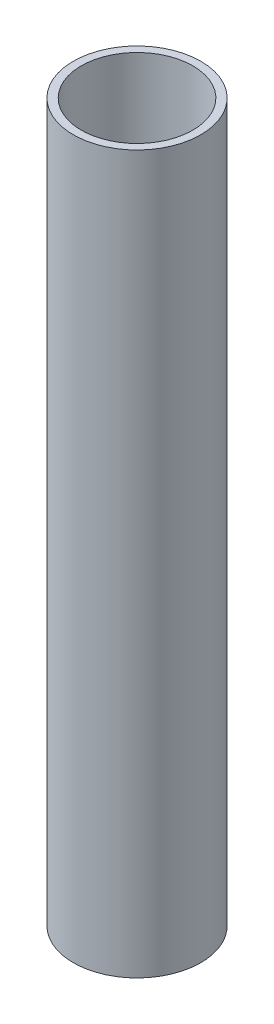
ISO-10303-21;
HEADER;
FILE_DESCRIPTION(('STEP AP214'),'2;1');
FILE_NAME('part.step','',(''),(''),'','','');
FILE_SCHEMA(('AUTOMOTIVE_DESIGN { 1 0 10303 214 1 1 1 1 }'));
ENDSEC;
DATA;
#1=APPLICATION_CONTEXT('core data for automotive mechanical design processes');
#2=APPLICATION_PROTOCOL_DEFINITION('international standard','automotive_design',2000,#1);
#3=PRODUCT_CONTEXT('',#1,'mechanical');
#4=PRODUCT('Part','Part','',(#3));
#5=PRODUCT_RELATED_PRODUCT_CATEGORY('part','',(#4));
#6=PRODUCT_DEFINITION_FORMATION('','',#4);
#7=PRODUCT_DEFINITION_CONTEXT('part definition',#1,'design');
#8=PRODUCT_DEFINITION('design','',#6,#7);
#9=PRODUCT_DEFINITION_SHAPE('','',#8);
#10=(LENGTH_UNIT() NAMED_UNIT(*) SI_UNIT(.MILLI.,.METRE.));
#11=(NAMED_UNIT(*) PLANE_ANGLE_UNIT() SI_UNIT($,.RADIAN.));
#12=(NAMED_UNIT(*) SI_UNIT($,.STERADIAN.) SOLID_ANGLE_UNIT());
#13=UNCERTAINTY_MEASURE_WITH_UNIT(LENGTH_MEASURE(1.E-05),#10,'distance_accuracy_value','');
#14=(GEOMETRIC_REPRESENTATION_CONTEXT(3) GLOBAL_UNCERTAINTY_ASSIGNED_CONTEXT((#13)) GLOBAL_UNIT_ASSIGNED_CONTEXT((#10,
#11,#12)) REPRESENTATION_CONTEXT('',''));
#15=CARTESIAN_POINT('',(0.,0.,0.));
#16=DIRECTION('',(0.,0.,1.));
#17=DIRECTION('',(1.,0.,0.));
#18=AXIS2_PLACEMENT_3D('',#15,#16,#17);
#19=CARTESIAN_POINT('',(0.,90.,0.));
#20=DIRECTION('',(0.,1.,0.));
#21=DIRECTION('',(0.,0.,1.));
#22=AXIS2_PLACEMENT_3D('',#19,#20,#21);
#23=PLANE('',#22);
#24=CARTESIAN_POINT('',(0.,90.,0.));
#25=DIRECTION('',(0.,1.,0.));
#26=DIRECTION('',(0.,0.,1.));
#27=AXIS2_PLACEMENT_3D('',#24,#25,#26);
#28=CIRCLE('',#27,8.);
#29=CARTESIAN_POINT('',(0.,90.,-8.));
#30=VERTEX_POINT('',#29);
#31=EDGE_CURVE('E10',#30,#30,#28,.T.);
#32=ORIENTED_EDGE('',*,*,#31,.T.);
#33=EDGE_LOOP('',(#32));
#34=FACE_BOUND('',#33,.T.);
#35=CARTESIAN_POINT('',(0.,90.,0.));
#36=DIRECTION('',(0.,1.,0.));
#37=DIRECTION('',(0.,0.,1.));
#38=AXIS2_PLACEMENT_3D('',#35,#36,#37);
#39=CIRCLE('',#38,7.);
#40=CARTESIAN_POINT('',(0.,90.,-7.));
#41=VERTEX_POINT('',#40);
#42=EDGE_CURVE('E52',#41,#41,#39,.T.);
#43=ORIENTED_EDGE('',*,*,#42,.F.);
#44=EDGE_LOOP('',(#43));
#45=FACE_BOUND('',#44,.T.);
#46=ADVANCED_FACE('F39',(#34,#45),#23,.T.);
#47=CARTESIAN_POINT('',(0.,0.,0.));
#48=DIRECTION('',(0.,1.,0.));
#49=DIRECTION('',(0.,0.,1.));
#50=AXIS2_PLACEMENT_3D('',#47,#48,#49);
#51=PLANE('',#50);
#52=CARTESIAN_POINT('',(0.,0.,0.));
#53=DIRECTION('',(0.,1.,0.));
#54=DIRECTION('',(0.,0.,1.));
#55=AXIS2_PLACEMENT_3D('',#52,#53,#54);
#56=CIRCLE('',#55,8.);
#57=CARTESIAN_POINT('',(0.,0.,-8.));
#58=VERTEX_POINT('',#57);
#59=EDGE_CURVE('E43',#58,#58,#56,.T.);
#60=ORIENTED_EDGE('',*,*,#59,.F.);
#61=EDGE_LOOP('',(#60));
#62=FACE_BOUND('',#61,.T.);
#63=CARTESIAN_POINT('',(0.,0.,0.));
#64=DIRECTION('',(0.,1.,0.));
#65=DIRECTION('',(0.,0.,1.));
#66=AXIS2_PLACEMENT_3D('',#63,#64,#65);
#67=CIRCLE('',#66,7.);
#68=CARTESIAN_POINT('',(0.,0.,-7.));
#69=VERTEX_POINT('',#68);
#70=EDGE_CURVE('E54',#69,#69,#67,.T.);
#71=ORIENTED_EDGE('',*,*,#70,.T.);
#72=EDGE_LOOP('',(#71));
#73=FACE_BOUND('',#72,.T.);
#74=ADVANCED_FACE('F66',(#62,#73),#51,.F.);
#75=CARTESIAN_POINT('',(0.,90.,0.));
#76=DIRECTION('',(0.,-1.,0.));
#77=DIRECTION('',(0.,0.,-1.));
#78=AXIS2_PLACEMENT_3D('',#75,#76,#77);
#79=CYLINDRICAL_SURFACE('',#78,8.);
#80=CARTESIAN_POINT('',(0.,90.,-8.));
#81=CARTESIAN_POINT('',(0.,89.0625,-8.));
#82=CARTESIAN_POINT('',(0.,88.125,-8.));
#83=CARTESIAN_POINT('',(0.,86.25,-8.));
#84=CARTESIAN_POINT('',(0.,85.3125,-8.));
#85=CARTESIAN_POINT('',(0.,83.4375,-8.));
#86=CARTESIAN_POINT('',(0.,82.5,-8.));
#87=CARTESIAN_POINT('',(0.,80.625,-8.));
#88=CARTESIAN_POINT('',(0.,79.6875,-8.));
#89=CARTESIAN_POINT('',(0.,77.8125,-8.));
#90=CARTESIAN_POINT('',(0.,76.875,-8.));
#91=CARTESIAN_POINT('',(0.,75.,-8.));
#92=CARTESIAN_POINT('',(0.,74.0625,-8.));
#93=CARTESIAN_POINT('',(0.,72.1875,-8.));
#94=CARTESIAN_POINT('',(0.,71.25,-8.));
#95=CARTESIAN_POINT('',(0.,69.375,-8.));
#96=CARTESIAN_POINT('',(0.,68.4375,-8.));
#97=CARTESIAN_POINT('',(0.,66.5625,-8.));
#98=CARTESIAN_POINT('',(0.,65.625,-8.));
#99=CARTESIAN_POINT('',(0.,63.75,-8.));
#100=CARTESIAN_POINT('',(0.,62.8125,-8.));
#101=CARTESIAN_POINT('',(0.,60.9375,-8.));
#102=CARTESIAN_POINT('',(0.,60.,-8.));
#103=CARTESIAN_POINT('',(0.,58.125,-8.));
#104=CARTESIAN_POINT('',(0.,57.1875,-8.));
#105=CARTESIAN_POINT('',(0.,55.3125,-8.));
#106=CARTESIAN_POINT('',(0.,54.375,-8.));
#107=CARTESIAN_POINT('',(0.,52.5,-8.));
#108=CARTESIAN_POINT('',(0.,51.5625,-8.));
#109=CARTESIAN_POINT('',(0.,49.6875,-8.));
#110=CARTESIAN_POINT('',(0.,48.75,-8.));
#111=CARTESIAN_POINT('',(0.,46.875,-8.));
#112=CARTESIAN_POINT('',(0.,45.9375,-8.));
#113=CARTESIAN_POINT('',(0.,44.0625,-8.));
#114=CARTESIAN_POINT('',(0.,43.125,-8.));
#115=CARTESIAN_POINT('',(0.,41.25,-8.));
#116=CARTESIAN_POINT('',(0.,40.3125,-8.));
#117=CARTESIAN_POINT('',(0.,38.4375,-8.));
#118=CARTESIAN_POINT('',(0.,37.5,-8.));
#119=CARTESIAN_POINT('',(0.,35.625,-8.));
#120=CARTESIAN_POINT('',(0.,34.6875,-8.));
#121=CARTESIAN_POINT('',(0.,32.8125,-8.));
#122=CARTESIAN_POINT('',(0.,31.875,-8.));
#123=CARTESIAN_POINT('',(0.,30.,-8.));
#124=CARTESIAN_POINT('',(0.,29.0625,-8.));
#125=CARTESIAN_POINT('',(0.,27.1875,-8.));
#126=CARTESIAN_POINT('',(0.,26.25,-8.));
#127=CARTESIAN_POINT('',(0.,24.375,-8.));
#128=CARTESIAN_POINT('',(0.,23.4375,-8.));
#129=CARTESIAN_POINT('',(0.,21.5625,-8.));
#130=CARTESIAN_POINT('',(0.,20.625,-8.));
#131=CARTESIAN_POINT('',(0.,18.75,-8.));
#132=CARTESIAN_POINT('',(0.,17.8125,-8.));
#133=CARTESIAN_POINT('',(0.,15.9375,-8.));
#134=CARTESIAN_POINT('',(0.,15.,-8.));
#135=CARTESIAN_POINT('',(0.,13.125,-8.));
#136=CARTESIAN_POINT('',(0.,12.1875,-8.));
#137=CARTESIAN_POINT('',(0.,10.3125,-8.));
#138=CARTESIAN_POINT('',(0.,9.37499999999999,-8.));
#139=CARTESIAN_POINT('',(0.,7.49999999999999,-8.));
#140=CARTESIAN_POINT('',(0.,6.56249999999999,-8.));
#141=CARTESIAN_POINT('',(0.,4.68749999999999,-8.));
#142=CARTESIAN_POINT('',(0.,3.74999999999998,-8.));
#143=CARTESIAN_POINT('',(0.,1.87499999999998,-8.));
#144=CARTESIAN_POINT('',(0.,0.937499999999986,-8.));
#145=CARTESIAN_POINT('',(0.,0.,-8.));
#146=B_SPLINE_CURVE_WITH_KNOTS('',3,(#80,#81,#82,#83,#84,#85,#86,#87,#88,#89,#90,#91,#92,#93,
#94,#95,#96,#97,#98,#99,#100,#101,#102,#103,#104,#105,#106,#107,#108,#109,#110,#111,#112,#113,
#114,#115,#116,#117,#118,#119,#120,#121,#122,#123,#124,#125,#126,#127,#128,#129,#130,#131,#132,
#133,#134,#135,#136,#137,#138,#139,#140,#141,#142,#143,#144,#145),.UNSPECIFIED.,.F.,.F.,(4,2,2,
2,2,2,2,2,2,2,2,2,2,2,2,2,2,2,2,2,2,2,2,2,2,2,2,2,2,2,2,2,4),(0.,2.8125,5.62499999999999,
8.43749999999999,11.25,14.0625,16.875,19.6875,22.5,25.3125,28.125,30.9375,33.75,36.5625,39.375,
42.1875,45.,47.8125,50.625,53.4375,56.25,59.0625,61.875,64.6875,67.5,70.3125,73.125,75.9375,
78.75,81.5625,84.375,87.1875,90.),.UNSPECIFIED.);
#147=EDGE_CURVE('BSEAM41',#30,#58,#146,.T.);
#148=ORIENTED_EDGE('',*,*,#31,.F.);
#149=ORIENTED_EDGE('',*,*,#59,.T.);
#150=ORIENTED_EDGE('',*,*,#147,.T.);
#151=ORIENTED_EDGE('',*,*,#147,.F.);
#152=EDGE_LOOP('',(#148,#150,#149,#151));
#153=FACE_BOUND('',#152,.T.);
#154=ADVANCED_FACE('F41',(#153),#79,.T.);
#155=CARTESIAN_POINT('',(0.,90.,0.));
#156=DIRECTION('',(0.,-1.,0.));
#157=DIRECTION('',(0.,0.,-1.));
#158=AXIS2_PLACEMENT_3D('',#155,#156,#157);
#159=CYLINDRICAL_SURFACE('',#158,7.);
#160=CARTESIAN_POINT('',(0.,90.,-7.));
#161=CARTESIAN_POINT('',(0.,89.0625,-7.));
#162=CARTESIAN_POINT('',(0.,88.125,-7.));
#163=CARTESIAN_POINT('',(0.,86.25,-7.));
#164=CARTESIAN_POINT('',(0.,85.3125,-7.));
#165=CARTESIAN_POINT('',(0.,83.4375,-7.));
#166=CARTESIAN_POINT('',(0.,82.5,-7.));
#167=CARTESIAN_POINT('',(0.,80.625,-7.));
#168=CARTESIAN_POINT('',(0.,79.6875,-7.));
#169=CARTESIAN_POINT('',(0.,77.8125,-7.));
#170=CARTESIAN_POINT('',(0.,76.875,-7.));
#171=CARTESIAN_POINT('',(0.,75.,-7.));
#172=CARTESIAN_POINT('',(0.,74.0625,-7.));
#173=CARTESIAN_POINT('',(0.,72.1875,-7.));
#174=CARTESIAN_POINT('',(0.,71.25,-7.));
#175=CARTESIAN_POINT('',(0.,69.375,-7.));
#176=CARTESIAN_POINT('',(0.,68.4375,-7.));
#177=CARTESIAN_POINT('',(0.,66.5625,-7.));
#178=CARTESIAN_POINT('',(0.,65.625,-7.));
#179=CARTESIAN_POINT('',(0.,63.75,-7.));
#180=CARTESIAN_POINT('',(0.,62.8125,-7.));
#181=CARTESIAN_POINT('',(0.,60.9375,-7.));
#182=CARTESIAN_POINT('',(0.,60.,-7.));
#183=CARTESIAN_POINT('',(0.,58.125,-7.));
#184=CARTESIAN_POINT('',(0.,57.1875,-7.));
#185=CARTESIAN_POINT('',(0.,55.3125,-7.));
#186=CARTESIAN_POINT('',(0.,54.375,-7.));
#187=CARTESIAN_POINT('',(0.,52.5,-7.));
#188=CARTESIAN_POINT('',(0.,51.5625,-7.));
#189=CARTESIAN_POINT('',(0.,49.6875,-7.));
#190=CARTESIAN_POINT('',(0.,48.75,-7.));
#191=CARTESIAN_POINT('',(0.,46.875,-7.));
#192=CARTESIAN_POINT('',(0.,45.9375,-7.));
#193=CARTESIAN_POINT('',(0.,44.0625,-7.));
#194=CARTESIAN_POINT('',(0.,43.125,-7.));
#195=CARTESIAN_POINT('',(0.,41.25,-7.));
#196=CARTESIAN_POINT('',(0.,40.3125,-7.));
#197=CARTESIAN_POINT('',(0.,38.4375,-7.));
#198=CARTESIAN_POINT('',(0.,37.5,-7.));
#199=CARTESIAN_POINT('',(0.,35.625,-7.));
#200=CARTESIAN_POINT('',(0.,34.6875,-7.));
#201=CARTESIAN_POINT('',(0.,32.8125,-7.));
#202=CARTESIAN_POINT('',(0.,31.875,-7.));
#203=CARTESIAN_POINT('',(0.,30.,-7.));
#204=CARTESIAN_POINT('',(0.,29.0625,-7.));
#205=CARTESIAN_POINT('',(0.,27.1875,-7.));
#206=CARTESIAN_POINT('',(0.,26.25,-7.));
#207=CARTESIAN_POINT('',(0.,24.375,-7.));
#208=CARTESIAN_POINT('',(0.,23.4375,-7.));
#209=CARTESIAN_POINT('',(0.,21.5625,-7.));
#210=CARTESIAN_POINT('',(0.,20.625,-7.));
#211=CARTESIAN_POINT('',(0.,18.75,-7.));
#212=CARTESIAN_POINT('',(0.,17.8125,-7.));
#213=CARTESIAN_POINT('',(0.,15.9375,-7.));
#214=CARTESIAN_POINT('',(0.,15.,-7.));
#215=CARTESIAN_POINT('',(0.,13.125,-7.));
#216=CARTESIAN_POINT('',(0.,12.1875,-7.));
#217=CARTESIAN_POINT('',(0.,10.3125,-7.));
#218=CARTESIAN_POINT('',(0.,9.37499999999999,-7.));
#219=CARTESIAN_POINT('',(0.,7.49999999999999,-7.));
#220=CARTESIAN_POINT('',(0.,6.56249999999999,-7.));
#221=CARTESIAN_POINT('',(0.,4.68749999999999,-7.));
#222=CARTESIAN_POINT('',(0.,3.74999999999998,-7.));
#223=CARTESIAN_POINT('',(0.,1.87499999999998,-7.));
#224=CARTESIAN_POINT('',(0.,0.937499999999986,-7.));
#225=CARTESIAN_POINT('',(0.,0.,-7.));
#226=B_SPLINE_CURVE_WITH_KNOTS('',3,(#160,#161,#162,#163,#164,#165,#166,#167,#168,#169,#170,
#171,#172,#173,#174,#175,#176,#177,#178,#179,#180,#181,#182,#183,#184,#185,#186,#187,#188,#189,
#190,#191,#192,#193,#194,#195,#196,#197,#198,#199,#200,#201,#202,#203,#204,#205,#206,#207,#208,
#209,#210,#211,#212,#213,#214,#215,#216,#217,#218,#219,#220,#221,#222,#223,#224,#225),
.UNSPECIFIED.,.F.,.F.,(4,2,2,2,2,2,2,2,2,2,2,2,2,2,2,2,2,2,2,2,2,2,2,2,2,2,2,2,2,2,2,2,4),(0.,
2.81250000000001,5.62500000000001,8.43750000000001,11.25,14.0625,16.875,19.6875,22.5,25.3125,
28.125,30.9375,33.75,36.5625,39.375,42.1875,45.,47.8125,50.625,53.4375,56.25,59.0625,61.875,
64.6875,67.5,70.3125,73.125,75.9375,78.75,81.5625,84.375,87.1875,90.),.UNSPECIFIED.);
#227=EDGE_CURVE('BSEAM62',#41,#69,#226,.T.);
#228=ORIENTED_EDGE('',*,*,#42,.T.);
#229=ORIENTED_EDGE('',*,*,#70,.F.);
#230=ORIENTED_EDGE('',*,*,#227,.T.);
#231=ORIENTED_EDGE('',*,*,#227,.F.);
#232=EDGE_LOOP('',(#228,#230,#229,#231));
#233=FACE_BOUND('',#232,.T.);
#234=ADVANCED_FACE('F62',(#233),#159,.F.);
#235=CLOSED_SHELL('',(#46,#74,#154,#234));
#236=MANIFOLD_SOLID_BREP('B2',#235);
#237=ADVANCED_BREP_SHAPE_REPRESENTATION('',(#18,#236),#14);
#238=SHAPE_DEFINITION_REPRESENTATION(#9,#237);
ENDSEC;
END-ISO-10303-21;
